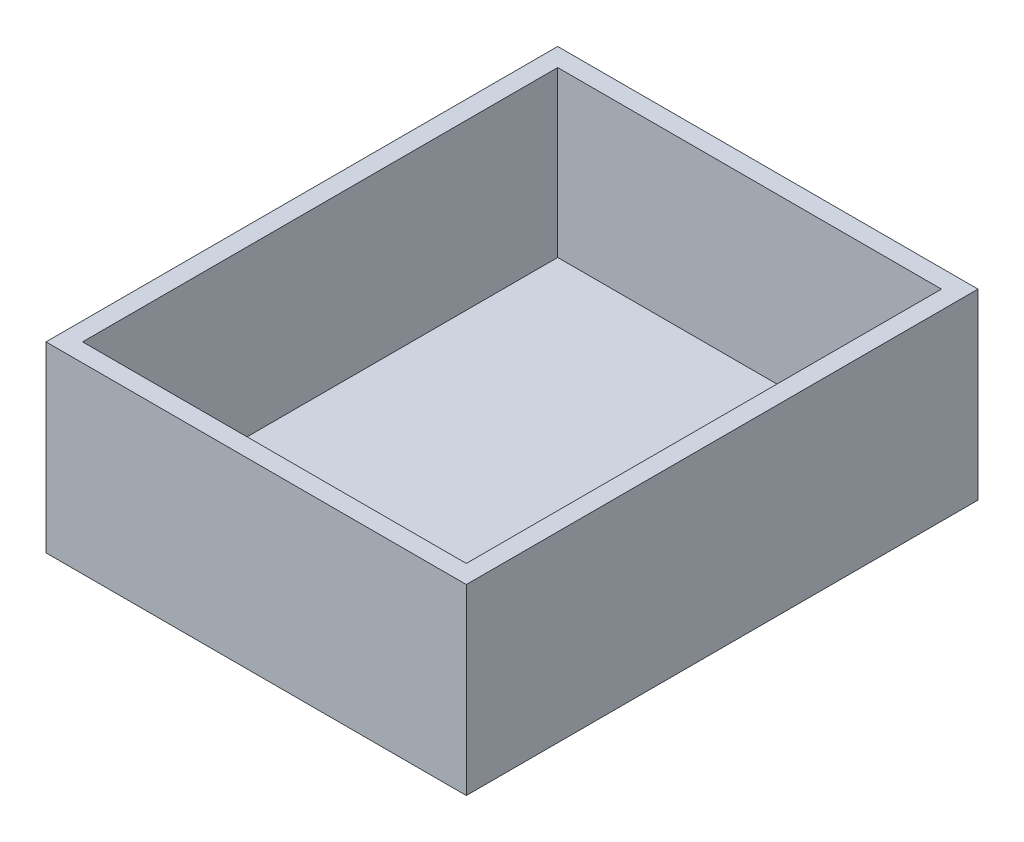
ISO-10303-21;
HEADER;
FILE_DESCRIPTION(('STEP AP214'),'2;1');
FILE_NAME('part.step','',(''),(''),'','','');
FILE_SCHEMA(('AUTOMOTIVE_DESIGN { 1 0 10303 214 1 1 1 1 }'));
ENDSEC;
DATA;
#1=APPLICATION_CONTEXT('core data for automotive mechanical design processes');
#2=APPLICATION_PROTOCOL_DEFINITION('international standard','automotive_design',2000,#1);
#3=PRODUCT_CONTEXT('',#1,'mechanical');
#4=PRODUCT('Part','Part','',(#3));
#5=PRODUCT_RELATED_PRODUCT_CATEGORY('part','',(#4));
#6=PRODUCT_DEFINITION_FORMATION('','',#4);
#7=PRODUCT_DEFINITION_CONTEXT('part definition',#1,'design');
#8=PRODUCT_DEFINITION('design','',#6,#7);
#9=PRODUCT_DEFINITION_SHAPE('','',#8);
#10=(LENGTH_UNIT() NAMED_UNIT(*) SI_UNIT(.MILLI.,.METRE.));
#11=(NAMED_UNIT(*) PLANE_ANGLE_UNIT() SI_UNIT($,.RADIAN.));
#12=(NAMED_UNIT(*) SI_UNIT($,.STERADIAN.) SOLID_ANGLE_UNIT());
#13=UNCERTAINTY_MEASURE_WITH_UNIT(LENGTH_MEASURE(1.E-05),#10,'distance_accuracy_value','');
#14=(GEOMETRIC_REPRESENTATION_CONTEXT(3) GLOBAL_UNCERTAINTY_ASSIGNED_CONTEXT((#13)) GLOBAL_UNIT_ASSIGNED_CONTEXT((#10,
#11,#12)) REPRESENTATION_CONTEXT('',''));
#15=CARTESIAN_POINT('',(0.,0.,0.));
#16=DIRECTION('',(0.,0.,1.));
#17=DIRECTION('',(1.,0.,0.));
#18=AXIS2_PLACEMENT_3D('',#15,#16,#17);
#19=CARTESIAN_POINT('',(57.5,50.,-70.));
#20=DIRECTION('',(-1.,0.,0.));
#21=DIRECTION('',(0.,0.,1.));
#22=AXIS2_PLACEMENT_3D('',#19,#20,#21);
#23=PLANE('',#22);
#24=DIRECTION('',(0.,0.,-1.));
#25=VECTOR('',#24,1.);
#26=CARTESIAN_POINT('',(57.5,0.,-70.));
#27=LINE('',#26,#25);
#28=CARTESIAN_POINT('',(57.5,0.,70.));
#29=VERTEX_POINT('',#28);
#30=CARTESIAN_POINT('',(57.5,0.,-70.));
#31=VERTEX_POINT('',#30);
#32=EDGE_CURVE('E142',#29,#31,#27,.T.);
#33=ORIENTED_EDGE('',*,*,#32,.T.);
#34=DIRECTION('',(0.,-1.,0.));
#35=VECTOR('',#34,1.);
#36=CARTESIAN_POINT('',(57.5,50.,-70.));
#37=LINE('',#36,#35);
#38=CARTESIAN_POINT('',(57.5,50.,-70.));
#39=VERTEX_POINT('',#38);
#40=EDGE_CURVE('E12',#39,#31,#37,.T.);
#41=ORIENTED_EDGE('',*,*,#40,.F.);
#42=DIRECTION('',(0.,0.,-1.));
#43=VECTOR('',#42,1.);
#44=CARTESIAN_POINT('',(57.5,50.,-70.));
#45=LINE('',#44,#43);
#46=CARTESIAN_POINT('',(57.5,50.,70.));
#47=VERTEX_POINT('',#46);
#48=EDGE_CURVE('E144',#47,#39,#45,.T.);
#49=ORIENTED_EDGE('',*,*,#48,.F.);
#50=DIRECTION('',(0.,-1.,0.));
#51=VECTOR('',#50,1.);
#52=CARTESIAN_POINT('',(57.5,50.,70.));
#53=LINE('',#52,#51);
#54=EDGE_CURVE('E150',#47,#29,#53,.T.);
#55=ORIENTED_EDGE('',*,*,#54,.T.);
#56=EDGE_LOOP('',(#33,#41,#49,#55));
#57=FACE_BOUND('',#56,.T.);
#58=ADVANCED_FACE('F36',(#57),#23,.F.);
#59=CARTESIAN_POINT('',(-57.5,50.,-70.));
#60=DIRECTION('',(0.,0.,1.));
#61=DIRECTION('',(1.,0.,0.));
#62=AXIS2_PLACEMENT_3D('',#59,#60,#61);
#63=PLANE('',#62);
#64=DIRECTION('',(-1.,0.,0.));
#65=VECTOR('',#64,1.);
#66=CARTESIAN_POINT('',(-57.5,0.,-70.));
#67=LINE('',#66,#65);
#68=CARTESIAN_POINT('',(-57.5,0.,-70.));
#69=VERTEX_POINT('',#68);
#70=EDGE_CURVE('E153',#31,#69,#67,.T.);
#71=ORIENTED_EDGE('',*,*,#70,.T.);
#72=DIRECTION('',(0.,-1.,0.));
#73=VECTOR('',#72,1.);
#74=CARTESIAN_POINT('',(-57.5,50.,-70.));
#75=LINE('',#74,#73);
#76=CARTESIAN_POINT('',(-57.5,50.,-70.));
#77=VERTEX_POINT('',#76);
#78=EDGE_CURVE('E43',#77,#69,#75,.T.);
#79=ORIENTED_EDGE('',*,*,#78,.F.);
#80=DIRECTION('',(-1.,0.,0.));
#81=VECTOR('',#80,1.);
#82=CARTESIAN_POINT('',(-57.5,50.,-70.));
#83=LINE('',#82,#81);
#84=EDGE_CURVE('E87',#39,#77,#83,.T.);
#85=ORIENTED_EDGE('',*,*,#84,.F.);
#86=ORIENTED_EDGE('',*,*,#40,.T.);
#87=EDGE_LOOP('',(#71,#79,#85,#86));
#88=FACE_BOUND('',#87,.T.);
#89=ADVANCED_FACE('F180',(#88),#63,.F.);
#90=CARTESIAN_POINT('',(-57.5,50.,-70.));
#91=DIRECTION('',(1.,0.,0.));
#92=DIRECTION('',(0.,0.,-1.));
#93=AXIS2_PLACEMENT_3D('',#90,#91,#92);
#94=PLANE('',#93);
#95=DIRECTION('',(0.,0.,1.));
#96=VECTOR('',#95,1.);
#97=CARTESIAN_POINT('',(-57.5,0.,-70.));
#98=LINE('',#97,#96);
#99=CARTESIAN_POINT('',(-57.5,0.,70.));
#100=VERTEX_POINT('',#99);
#101=EDGE_CURVE('E155',#69,#100,#98,.T.);
#102=ORIENTED_EDGE('',*,*,#101,.T.);
#103=DIRECTION('',(0.,-1.,0.));
#104=VECTOR('',#103,1.);
#105=CARTESIAN_POINT('',(-57.5,50.,70.));
#106=LINE('',#105,#104);
#107=CARTESIAN_POINT('',(-57.5,50.,70.));
#108=VERTEX_POINT('',#107);
#109=EDGE_CURVE('E159',#108,#100,#106,.T.);
#110=ORIENTED_EDGE('',*,*,#109,.F.);
#111=DIRECTION('',(0.,0.,1.));
#112=VECTOR('',#111,1.);
#113=CARTESIAN_POINT('',(-57.5,50.,-70.));
#114=LINE('',#113,#112);
#115=EDGE_CURVE('E147',#77,#108,#114,.T.);
#116=ORIENTED_EDGE('',*,*,#115,.F.);
#117=ORIENTED_EDGE('',*,*,#78,.T.);
#118=EDGE_LOOP('',(#102,#110,#116,#117));
#119=FACE_BOUND('',#118,.T.);
#120=ADVANCED_FACE('F164',(#119),#94,.F.);
#121=CARTESIAN_POINT('',(-57.5,50.,70.));
#122=DIRECTION('',(0.,0.,-1.));
#123=DIRECTION('',(-1.,0.,0.));
#124=AXIS2_PLACEMENT_3D('',#121,#122,#123);
#125=PLANE('',#124);
#126=DIRECTION('',(1.,0.,0.));
#127=VECTOR('',#126,1.);
#128=CARTESIAN_POINT('',(-57.5,0.,70.));
#129=LINE('',#128,#127);
#130=EDGE_CURVE('E80',#100,#29,#129,.T.);
#131=ORIENTED_EDGE('',*,*,#130,.T.);
#132=ORIENTED_EDGE('',*,*,#54,.F.);
#133=DIRECTION('',(1.,0.,0.));
#134=VECTOR('',#133,1.);
#135=CARTESIAN_POINT('',(-57.5,50.,70.));
#136=LINE('',#135,#134);
#137=EDGE_CURVE('E59',#108,#47,#136,.T.);
#138=ORIENTED_EDGE('',*,*,#137,.F.);
#139=ORIENTED_EDGE('',*,*,#109,.T.);
#140=EDGE_LOOP('',(#131,#132,#138,#139));
#141=FACE_BOUND('',#140,.T.);
#142=ADVANCED_FACE('F172',(#141),#125,.F.);
#143=CARTESIAN_POINT('',(0.,50.,0.));
#144=DIRECTION('',(0.,1.,0.));
#145=DIRECTION('',(0.,0.,1.));
#146=AXIS2_PLACEMENT_3D('',#143,#144,#145);
#147=PLANE('',#146);
#148=DIRECTION('',(0.,0.,-1.));
#149=VECTOR('',#148,1.);
#150=CARTESIAN_POINT('',(52.4948264719476,50.,-65.));
#151=LINE('',#150,#149);
#152=CARTESIAN_POINT('',(52.4948264719476,50.,65.));
#153=VERTEX_POINT('',#152);
#154=CARTESIAN_POINT('',(52.4948264719476,50.,-65.));
#155=VERTEX_POINT('',#154);
#156=EDGE_CURVE('E50',#153,#155,#151,.T.);
#157=ORIENTED_EDGE('',*,*,#156,.F.);
#158=DIRECTION('',(1.,0.,0.));
#159=VECTOR('',#158,1.);
#160=CARTESIAN_POINT('',(-52.4948264719475,50.,65.));
#161=LINE('',#160,#159);
#162=CARTESIAN_POINT('',(-52.4948264719475,50.,65.));
#163=VERTEX_POINT('',#162);
#164=EDGE_CURVE('E131',#163,#153,#161,.T.);
#165=ORIENTED_EDGE('',*,*,#164,.F.);
#166=DIRECTION('',(0.,0.,1.));
#167=VECTOR('',#166,1.);
#168=CARTESIAN_POINT('',(-52.4948264719476,50.,-65.));
#169=LINE('',#168,#167);
#170=CARTESIAN_POINT('',(-52.4948264719476,50.,-65.));
#171=VERTEX_POINT('',#170);
#172=EDGE_CURVE('E115',#171,#163,#169,.T.);
#173=ORIENTED_EDGE('',*,*,#172,.F.);
#174=DIRECTION('',(-1.,0.,0.));
#175=VECTOR('',#174,1.);
#176=CARTESIAN_POINT('',(-52.4948264719476,50.,-65.));
#177=LINE('',#176,#175);
#178=EDGE_CURVE('E125',#155,#171,#177,.T.);
#179=ORIENTED_EDGE('',*,*,#178,.F.);
#180=EDGE_LOOP('',(#157,#165,#173,#179));
#181=FACE_BOUND('',#180,.T.);
#182=ORIENTED_EDGE('',*,*,#48,.T.);
#183=ORIENTED_EDGE('',*,*,#84,.T.);
#184=ORIENTED_EDGE('',*,*,#115,.T.);
#185=ORIENTED_EDGE('',*,*,#137,.T.);
#186=EDGE_LOOP('',(#182,#183,#184,#185));
#187=FACE_BOUND('',#186,.T.);
#188=ADVANCED_FACE('F129',(#181,#187),#147,.T.);
#189=CARTESIAN_POINT('',(0.,0.,0.));
#190=DIRECTION('',(0.,1.,0.));
#191=DIRECTION('',(0.,0.,1.));
#192=AXIS2_PLACEMENT_3D('',#189,#190,#191);
#193=PLANE('',#192);
#194=ORIENTED_EDGE('',*,*,#32,.F.);
#195=ORIENTED_EDGE('',*,*,#130,.F.);
#196=ORIENTED_EDGE('',*,*,#101,.F.);
#197=ORIENTED_EDGE('',*,*,#70,.F.);
#198=EDGE_LOOP('',(#194,#195,#196,#197));
#199=FACE_BOUND('',#198,.T.);
#200=ADVANCED_FACE('F168',(#199),#193,.F.);
#201=CARTESIAN_POINT('',(52.4948264719476,-167.101248425257,-65.));
#202=DIRECTION('',(1.,0.,0.));
#203=DIRECTION('',(0.,0.,-1.));
#204=AXIS2_PLACEMENT_3D('',#201,#202,#203);
#205=PLANE('',#204);
#206=DIRECTION('',(0.,0.,1.));
#207=VECTOR('',#206,1.);
#208=CARTESIAN_POINT('',(52.4948264719476,5.,-65.));
#209=LINE('',#208,#207);
#210=CARTESIAN_POINT('',(52.4948264719476,5.,-65.));
#211=VERTEX_POINT('',#210);
#212=CARTESIAN_POINT('',(52.4948264719476,5.,65.));
#213=VERTEX_POINT('',#212);
#214=EDGE_CURVE('E143',#211,#213,#209,.T.);
#215=ORIENTED_EDGE('',*,*,#214,.T.);
#216=DIRECTION('',(0.,1.,0.));
#217=VECTOR('',#216,1.);
#218=CARTESIAN_POINT('',(52.4948264719476,-167.101248425257,65.));
#219=LINE('',#218,#217);
#220=EDGE_CURVE('E136',#213,#153,#219,.T.);
#221=ORIENTED_EDGE('',*,*,#220,.T.);
#222=ORIENTED_EDGE('',*,*,#156,.T.);
#223=DIRECTION('',(0.,1.,0.));
#224=VECTOR('',#223,1.);
#225=CARTESIAN_POINT('',(52.4948264719476,-167.101248425257,-65.));
#226=LINE('',#225,#224);
#227=EDGE_CURVE('E122',#211,#155,#226,.T.);
#228=ORIENTED_EDGE('',*,*,#227,.F.);
#229=EDGE_LOOP('',(#215,#221,#222,#228));
#230=FACE_BOUND('',#229,.T.);
#231=ADVANCED_FACE('F207',(#230),#205,.F.);
#232=CARTESIAN_POINT('',(-52.4948264719475,-167.101248425257,65.));
#233=DIRECTION('',(0.,0.,1.));
#234=DIRECTION('',(1.,0.,0.));
#235=AXIS2_PLACEMENT_3D('',#232,#233,#234);
#236=PLANE('',#235);
#237=DIRECTION('',(-1.,0.,0.));
#238=VECTOR('',#237,1.);
#239=CARTESIAN_POINT('',(-52.4948264719475,5.,65.));
#240=LINE('',#239,#238);
#241=CARTESIAN_POINT('',(-52.4948264719475,5.,65.));
#242=VERTEX_POINT('',#241);
#243=EDGE_CURVE('E261',#213,#242,#240,.T.);
#244=ORIENTED_EDGE('',*,*,#243,.T.);
#245=DIRECTION('',(0.,1.,0.));
#246=VECTOR('',#245,1.);
#247=CARTESIAN_POINT('',(-52.4948264719475,-167.101248425257,65.));
#248=LINE('',#247,#246);
#249=EDGE_CURVE('E121',#242,#163,#248,.T.);
#250=ORIENTED_EDGE('',*,*,#249,.T.);
#251=ORIENTED_EDGE('',*,*,#164,.T.);
#252=ORIENTED_EDGE('',*,*,#220,.F.);
#253=EDGE_LOOP('',(#244,#250,#251,#252));
#254=FACE_BOUND('',#253,.T.);
#255=ADVANCED_FACE('F220',(#254),#236,.F.);
#256=CARTESIAN_POINT('',(-52.4948264719476,-167.101248425257,-65.));
#257=DIRECTION('',(-1.,0.,0.));
#258=DIRECTION('',(0.,0.,1.));
#259=AXIS2_PLACEMENT_3D('',#256,#257,#258);
#260=PLANE('',#259);
#261=DIRECTION('',(0.,0.,-1.));
#262=VECTOR('',#261,1.);
#263=CARTESIAN_POINT('',(-52.4948264719476,5.,-65.));
#264=LINE('',#263,#262);
#265=CARTESIAN_POINT('',(-52.4948264719476,4.99999999999995,-65.));
#266=VERTEX_POINT('',#265);
#267=EDGE_CURVE('E118',#242,#266,#264,.T.);
#268=ORIENTED_EDGE('',*,*,#267,.T.);
#269=DIRECTION('',(0.,1.,0.));
#270=VECTOR('',#269,1.);
#271=CARTESIAN_POINT('',(-52.4948264719476,-167.101248425257,-65.));
#272=LINE('',#271,#270);
#273=EDGE_CURVE('E110',#266,#171,#272,.T.);
#274=ORIENTED_EDGE('',*,*,#273,.T.);
#275=ORIENTED_EDGE('',*,*,#172,.T.);
#276=ORIENTED_EDGE('',*,*,#249,.F.);
#277=EDGE_LOOP('',(#268,#274,#275,#276));
#278=FACE_BOUND('',#277,.T.);
#279=ADVANCED_FACE('F112',(#278),#260,.F.);
#280=CARTESIAN_POINT('',(-52.4948264719476,-167.101248425257,-65.));
#281=DIRECTION('',(0.,0.,-1.));
#282=DIRECTION('',(-1.,0.,0.));
#283=AXIS2_PLACEMENT_3D('',#280,#281,#282);
#284=PLANE('',#283);
#285=DIRECTION('',(1.,0.,0.));
#286=VECTOR('',#285,1.);
#287=CARTESIAN_POINT('',(-52.4948264719476,5.,-65.));
#288=LINE('',#287,#286);
#289=EDGE_CURVE('E140',#266,#211,#288,.T.);
#290=ORIENTED_EDGE('',*,*,#289,.T.);
#291=ORIENTED_EDGE('',*,*,#227,.T.);
#292=ORIENTED_EDGE('',*,*,#178,.T.);
#293=ORIENTED_EDGE('',*,*,#273,.F.);
#294=EDGE_LOOP('',(#290,#291,#292,#293));
#295=FACE_BOUND('',#294,.T.);
#296=ADVANCED_FACE('F126',(#295),#284,.F.);
#297=CARTESIAN_POINT('',(0.,5.,0.));
#298=DIRECTION('',(0.,1.,0.));
#299=DIRECTION('',(0.,0.,1.));
#300=AXIS2_PLACEMENT_3D('',#297,#298,#299);
#301=PLANE('',#300);
#302=ORIENTED_EDGE('',*,*,#214,.F.);
#303=ORIENTED_EDGE('',*,*,#289,.F.);
#304=ORIENTED_EDGE('',*,*,#267,.F.);
#305=ORIENTED_EDGE('',*,*,#243,.F.);
#306=EDGE_LOOP('',(#302,#303,#304,#305));
#307=FACE_BOUND('',#306,.T.);
#308=ADVANCED_FACE('F246',(#307),#301,.T.);
#309=CLOSED_SHELL('',(#58,#89,#120,#142,#188,#200,#231,#255,#279,#296,#308));
#310=MANIFOLD_SOLID_BREP('B2',#309);
#311=ADVANCED_BREP_SHAPE_REPRESENTATION('',(#18,#310),#14);
#312=SHAPE_DEFINITION_REPRESENTATION(#9,#311);
ENDSEC;
END-ISO-10303-21;
